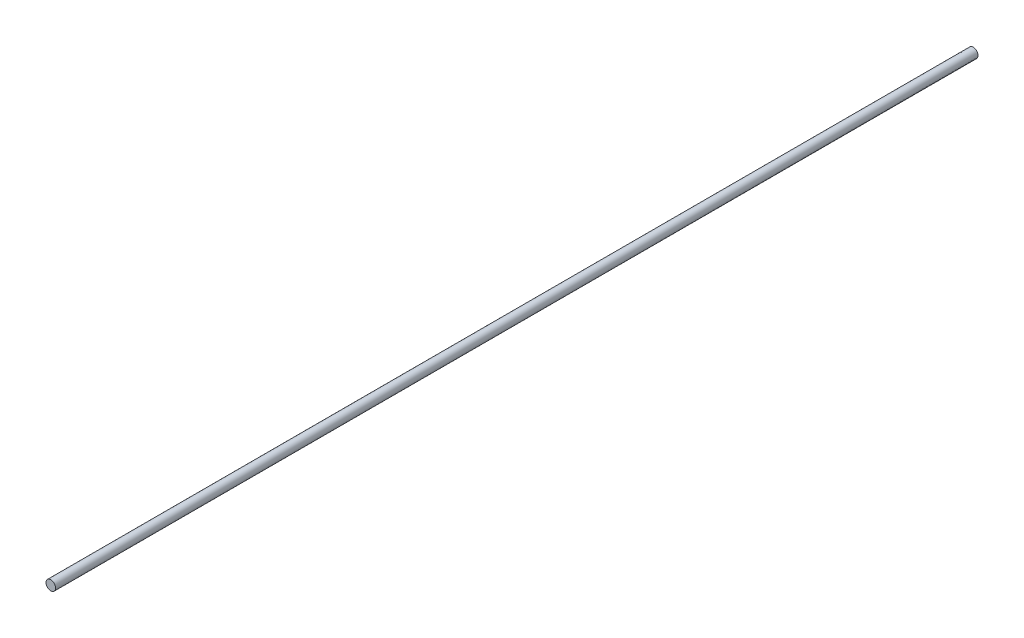
ISO-10303-21;
HEADER;
FILE_DESCRIPTION(('STEP AP214'),'2;1');
FILE_NAME('part.step','',(''),(''),'','','');
FILE_SCHEMA(('AUTOMOTIVE_DESIGN { 1 0 10303 214 1 1 1 1 }'));
ENDSEC;
DATA;
#1=APPLICATION_CONTEXT('core data for automotive mechanical design processes');
#2=APPLICATION_PROTOCOL_DEFINITION('international standard','automotive_design',2000,#1);
#3=PRODUCT_CONTEXT('',#1,'mechanical');
#4=PRODUCT('Part','Part','',(#3));
#5=PRODUCT_RELATED_PRODUCT_CATEGORY('part','',(#4));
#6=PRODUCT_DEFINITION_FORMATION('','',#4);
#7=PRODUCT_DEFINITION_CONTEXT('part definition',#1,'design');
#8=PRODUCT_DEFINITION('design','',#6,#7);
#9=PRODUCT_DEFINITION_SHAPE('','',#8);
#10=(LENGTH_UNIT() NAMED_UNIT(*) SI_UNIT(.MILLI.,.METRE.));
#11=(NAMED_UNIT(*) PLANE_ANGLE_UNIT() SI_UNIT($,.RADIAN.));
#12=(NAMED_UNIT(*) SI_UNIT($,.STERADIAN.) SOLID_ANGLE_UNIT());
#13=UNCERTAINTY_MEASURE_WITH_UNIT(LENGTH_MEASURE(1.E-05),#10,'distance_accuracy_value','');
#14=(GEOMETRIC_REPRESENTATION_CONTEXT(3) GLOBAL_UNCERTAINTY_ASSIGNED_CONTEXT((#13)) GLOBAL_UNIT_ASSIGNED_CONTEXT((#10,
#11,#12)) REPRESENTATION_CONTEXT('',''));
#15=CARTESIAN_POINT('',(0.,0.,0.));
#16=DIRECTION('',(0.,0.,1.));
#17=DIRECTION('',(1.,0.,0.));
#18=AXIS2_PLACEMENT_3D('',#15,#16,#17);
#19=CARTESIAN_POINT('',(0.,0.,609.6));
#20=DIRECTION('',(0.,0.,-1.));
#21=DIRECTION('',(-1.,0.,0.));
#22=AXIS2_PLACEMENT_3D('',#19,#20,#21);
#23=CYLINDRICAL_SURFACE('',#22,3.175);
#24=CARTESIAN_POINT('',(0.,0.,609.6));
#25=DIRECTION('',(0.,0.,1.));
#26=DIRECTION('',(1.,0.,0.));
#27=AXIS2_PLACEMENT_3D('',#24,#25,#26);
#28=CIRCLE('',#27,3.175);
#29=CARTESIAN_POINT('',(-3.175,0.,609.6));
#30=VERTEX_POINT('',#29);
#31=EDGE_CURVE('E10',#30,#30,#28,.T.);
#32=CARTESIAN_POINT('',(0.,0.,0.));
#33=DIRECTION('',(0.,0.,1.));
#34=DIRECTION('',(1.,0.,0.));
#35=AXIS2_PLACEMENT_3D('',#32,#33,#34);
#36=CIRCLE('',#35,3.175);
#37=CARTESIAN_POINT('',(-3.175,0.,0.));
#38=VERTEX_POINT('',#37);
#39=EDGE_CURVE('E34',#38,#38,#36,.T.);
#40=CARTESIAN_POINT('',(-3.175,0.,609.6));
#41=CARTESIAN_POINT('',(-3.175,0.,603.25));
#42=CARTESIAN_POINT('',(-3.175,0.,596.9));
#43=CARTESIAN_POINT('',(-3.175,0.,584.2));
#44=CARTESIAN_POINT('',(-3.175,0.,577.85));
#45=CARTESIAN_POINT('',(-3.175,0.,565.15));
#46=CARTESIAN_POINT('',(-3.175,0.,558.8));
#47=CARTESIAN_POINT('',(-3.175,0.,546.1));
#48=CARTESIAN_POINT('',(-3.175,0.,539.75));
#49=CARTESIAN_POINT('',(-3.175,0.,527.05));
#50=CARTESIAN_POINT('',(-3.175,0.,520.7));
#51=CARTESIAN_POINT('',(-3.175,0.,508.));
#52=CARTESIAN_POINT('',(-3.175,0.,501.65));
#53=CARTESIAN_POINT('',(-3.175,0.,488.95));
#54=CARTESIAN_POINT('',(-3.175,0.,482.6));
#55=CARTESIAN_POINT('',(-3.175,0.,469.9));
#56=CARTESIAN_POINT('',(-3.175,0.,463.55));
#57=CARTESIAN_POINT('',(-3.175,0.,450.85));
#58=CARTESIAN_POINT('',(-3.175,0.,444.5));
#59=CARTESIAN_POINT('',(-3.175,0.,431.8));
#60=CARTESIAN_POINT('',(-3.175,0.,425.45));
#61=CARTESIAN_POINT('',(-3.175,0.,412.75));
#62=CARTESIAN_POINT('',(-3.175,0.,406.4));
#63=CARTESIAN_POINT('',(-3.175,0.,393.7));
#64=CARTESIAN_POINT('',(-3.175,0.,387.35));
#65=CARTESIAN_POINT('',(-3.175,0.,374.65));
#66=CARTESIAN_POINT('',(-3.175,0.,368.3));
#67=CARTESIAN_POINT('',(-3.175,0.,355.6));
#68=CARTESIAN_POINT('',(-3.175,0.,349.25));
#69=CARTESIAN_POINT('',(-3.175,0.,336.55));
#70=CARTESIAN_POINT('',(-3.175,0.,330.2));
#71=CARTESIAN_POINT('',(-3.175,0.,317.5));
#72=CARTESIAN_POINT('',(-3.175,0.,311.15));
#73=CARTESIAN_POINT('',(-3.175,0.,298.45));
#74=CARTESIAN_POINT('',(-3.175,0.,292.1));
#75=CARTESIAN_POINT('',(-3.175,0.,279.4));
#76=CARTESIAN_POINT('',(-3.175,0.,273.05));
#77=CARTESIAN_POINT('',(-3.175,0.,260.35));
#78=CARTESIAN_POINT('',(-3.175,0.,254.));
#79=CARTESIAN_POINT('',(-3.175,0.,241.3));
#80=CARTESIAN_POINT('',(-3.175,0.,234.95));
#81=CARTESIAN_POINT('',(-3.175,0.,222.25));
#82=CARTESIAN_POINT('',(-3.175,0.,215.9));
#83=CARTESIAN_POINT('',(-3.175,0.,203.2));
#84=CARTESIAN_POINT('',(-3.175,0.,196.85));
#85=CARTESIAN_POINT('',(-3.175,0.,184.15));
#86=CARTESIAN_POINT('',(-3.175,0.,177.8));
#87=CARTESIAN_POINT('',(-3.175,0.,165.1));
#88=CARTESIAN_POINT('',(-3.175,0.,158.75));
#89=CARTESIAN_POINT('',(-3.175,0.,146.05));
#90=CARTESIAN_POINT('',(-3.175,0.,139.7));
#91=CARTESIAN_POINT('',(-3.175,0.,127.));
#92=CARTESIAN_POINT('',(-3.175,0.,120.65));
#93=CARTESIAN_POINT('',(-3.175,0.,107.95));
#94=CARTESIAN_POINT('',(-3.175,0.,101.6));
#95=CARTESIAN_POINT('',(-3.175,0.,88.9));
#96=CARTESIAN_POINT('',(-3.175,0.,82.5500000000001));
#97=CARTESIAN_POINT('',(-3.175,0.,69.85));
#98=CARTESIAN_POINT('',(-3.175,0.,63.5));
#99=CARTESIAN_POINT('',(-3.175,0.,50.8));
#100=CARTESIAN_POINT('',(-3.175,0.,44.45));
#101=CARTESIAN_POINT('',(-3.175,0.,31.75));
#102=CARTESIAN_POINT('',(-3.175,0.,25.4));
#103=CARTESIAN_POINT('',(-3.175,0.,12.7));
#104=CARTESIAN_POINT('',(-3.175,0.,6.35000000000001));
#105=CARTESIAN_POINT('',(-3.175,0.,0.));
#106=B_SPLINE_CURVE_WITH_KNOTS('',3,(#40,#41,#42,#43,#44,#45,#46,#47,#48,#49,#50,#51,#52,#53,
#54,#55,#56,#57,#58,#59,#60,#61,#62,#63,#64,#65,#66,#67,#68,#69,#70,#71,#72,#73,#74,#75,#76,#77,
#78,#79,#80,#81,#82,#83,#84,#85,#86,#87,#88,#89,#90,#91,#92,#93,#94,#95,#96,#97,#98,#99,#100,
#101,#102,#103,#104,#105),.UNSPECIFIED.,.F.,.F.,(4,2,2,2,2,2,2,2,2,2,2,2,2,2,2,2,2,2,2,2,2,2,2,
2,2,2,2,2,2,2,2,2,4),(0.,19.05,38.1,57.15,76.2,95.2500000000001,114.3,133.35,152.4,171.45,190.5,
209.55,228.6,247.65,266.7,285.75,304.8,323.85,342.9,361.95,381.,400.05,419.1,438.15,457.2,
476.25,495.3,514.35,533.4,552.45,571.5,590.55,609.6),.UNSPECIFIED.);
#107=EDGE_CURVE('BSEAM31',#30,#38,#106,.T.);
#108=ORIENTED_EDGE('',*,*,#31,.F.);
#109=ORIENTED_EDGE('',*,*,#39,.T.);
#110=ORIENTED_EDGE('',*,*,#107,.T.);
#111=ORIENTED_EDGE('',*,*,#107,.F.);
#112=EDGE_LOOP('',(#108,#110,#109,#111));
#113=FACE_BOUND('',#112,.T.);
#114=ADVANCED_FACE('F31',(#113),#23,.T.);
#115=CARTESIAN_POINT('',(0.,0.,609.6));
#116=DIRECTION('',(0.,0.,1.));
#117=DIRECTION('',(1.,0.,0.));
#118=AXIS2_PLACEMENT_3D('',#115,#116,#117);
#119=PLANE('',#118);
#120=ORIENTED_EDGE('',*,*,#31,.T.);
#121=EDGE_LOOP('',(#120));
#122=FACE_BOUND('',#121,.T.);
#123=ADVANCED_FACE('F46',(#122),#119,.T.);
#124=CARTESIAN_POINT('',(0.,0.,0.));
#125=DIRECTION('',(0.,0.,1.));
#126=DIRECTION('',(1.,0.,0.));
#127=AXIS2_PLACEMENT_3D('',#124,#125,#126);
#128=PLANE('',#127);
#129=ORIENTED_EDGE('',*,*,#39,.F.);
#130=EDGE_LOOP('',(#129));
#131=FACE_BOUND('',#130,.T.);
#132=ADVANCED_FACE('F44',(#131),#128,.F.);
#133=CLOSED_SHELL('',(#114,#123,#132));
#134=MANIFOLD_SOLID_BREP('B2',#133);
#135=ADVANCED_BREP_SHAPE_REPRESENTATION('',(#18,#134),#14);
#136=SHAPE_DEFINITION_REPRESENTATION(#9,#135);
ENDSEC;
END-ISO-10303-21;
